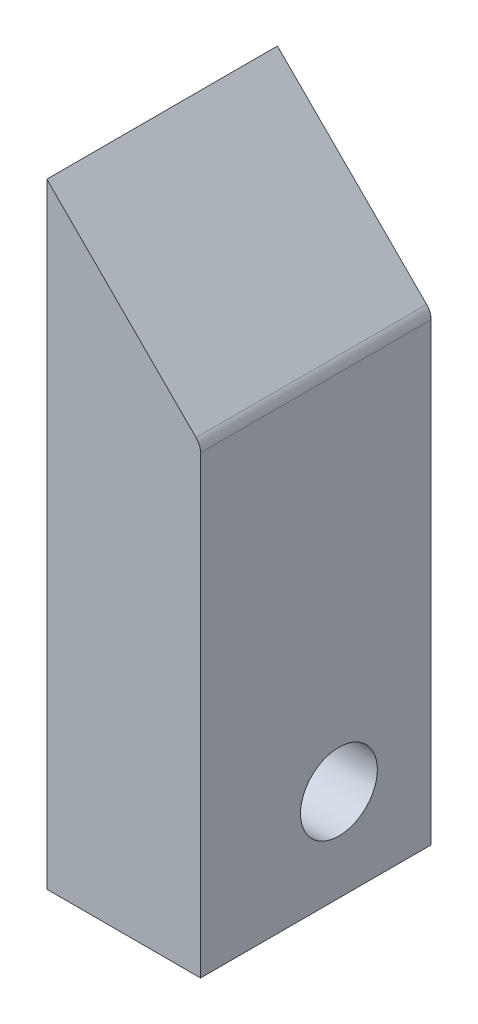
ISO-10303-21;
HEADER;
FILE_DESCRIPTION(('STEP AP214'),'2;1');
FILE_NAME('part.step','',(''),(''),'','','');
FILE_SCHEMA(('AUTOMOTIVE_DESIGN { 1 0 10303 214 1 1 1 1 }'));
ENDSEC;
DATA;
#1=APPLICATION_CONTEXT('core data for automotive mechanical design processes');
#2=APPLICATION_PROTOCOL_DEFINITION('international standard','automotive_design',2000,#1);
#3=PRODUCT_CONTEXT('',#1,'mechanical');
#4=PRODUCT('Part','Part','',(#3));
#5=PRODUCT_RELATED_PRODUCT_CATEGORY('part','',(#4));
#6=PRODUCT_DEFINITION_FORMATION('','',#4);
#7=PRODUCT_DEFINITION_CONTEXT('part definition',#1,'design');
#8=PRODUCT_DEFINITION('design','',#6,#7);
#9=PRODUCT_DEFINITION_SHAPE('','',#8);
#10=(LENGTH_UNIT() NAMED_UNIT(*) SI_UNIT(.MILLI.,.METRE.));
#11=(NAMED_UNIT(*) PLANE_ANGLE_UNIT() SI_UNIT($,.RADIAN.));
#12=(NAMED_UNIT(*) SI_UNIT($,.STERADIAN.) SOLID_ANGLE_UNIT());
#13=UNCERTAINTY_MEASURE_WITH_UNIT(LENGTH_MEASURE(1.E-05),#10,'distance_accuracy_value','');
#14=(GEOMETRIC_REPRESENTATION_CONTEXT(3) GLOBAL_UNCERTAINTY_ASSIGNED_CONTEXT((#13)) GLOBAL_UNIT_ASSIGNED_CONTEXT((#10,
#11,#12)) REPRESENTATION_CONTEXT('',''));
#15=CARTESIAN_POINT('',(0.,0.,0.));
#16=DIRECTION('',(0.,0.,1.));
#17=DIRECTION('',(1.,0.,0.));
#18=AXIS2_PLACEMENT_3D('',#15,#16,#17);
#19=CARTESIAN_POINT('',(0.,6.,6.));
#20=DIRECTION('',(1.,0.,0.));
#21=DIRECTION('',(0.,1.,0.));
#22=AXIS2_PLACEMENT_3D('',#19,#20,#21);
#23=CYLINDRICAL_SURFACE('',#22,2.5);
#24=CARTESIAN_POINT('',(10.,6.,6.));
#25=DIRECTION('',(1.,0.,0.));
#26=DIRECTION('',(0.,1.,0.));
#27=AXIS2_PLACEMENT_3D('',#24,#25,#26);
#28=CIRCLE('',#27,2.5);
#29=CARTESIAN_POINT('',(10.,8.5,6.));
#30=VERTEX_POINT('',#29);
#31=EDGE_CURVE('E175',#30,#30,#28,.T.);
#32=ORIENTED_EDGE('',*,*,#31,.T.);
#33=EDGE_LOOP('',(#32));
#34=FACE_BOUND('',#33,.T.);
#35=DIRECTION('',(-1.,0.,0.));
#36=VECTOR('',#35,1.);
#37=CARTESIAN_POINT('',(0.,3.5,6.));
#38=LINE('',#37,#36);
#39=CARTESIAN_POINT('',(2.5,3.5,6.));
#40=VERTEX_POINT('',#39);
#41=CARTESIAN_POINT('',(0.,3.5,6.));
#42=VERTEX_POINT('',#41);
#43=EDGE_CURVE('E131',#40,#42,#38,.T.);
#44=ORIENTED_EDGE('',*,*,#43,.T.);
#45=CARTESIAN_POINT('',(0.,6.,6.));
#46=DIRECTION('',(1.,0.,0.));
#47=DIRECTION('',(0.,1.,0.));
#48=AXIS2_PLACEMENT_3D('',#45,#46,#47);
#49=CIRCLE('',#48,2.5);
#50=CARTESIAN_POINT('',(0.,8.5,6.));
#51=VERTEX_POINT('',#50);
#52=EDGE_CURVE('E167',#51,#42,#49,.T.);
#53=ORIENTED_EDGE('',*,*,#52,.F.);
#54=DIRECTION('',(-1.,0.,0.));
#55=VECTOR('',#54,1.);
#56=CARTESIAN_POINT('',(0.,8.5,6.));
#57=LINE('',#56,#55);
#58=CARTESIAN_POINT('',(2.5,8.5,6.));
#59=VERTEX_POINT('',#58);
#60=EDGE_CURVE('E128',#59,#51,#57,.T.);
#61=ORIENTED_EDGE('',*,*,#60,.F.);
#62=CARTESIAN_POINT('',(2.5,6.,6.));
#63=DIRECTION('',(0.707106781186547,0.,0.707106781186547));
#64=DIRECTION('',(0.707106781186547,0.,-0.707106781186547));
#65=AXIS2_PLACEMENT_3D('',#62,#63,#64);
#66=ELLIPSE('',#65,3.53553390593274,2.5);
#67=EDGE_CURVE('E121',#59,#40,#66,.F.);
#68=ORIENTED_EDGE('',*,*,#67,.T.);
#69=EDGE_LOOP('',(#44,#53,#61,#68));
#70=FACE_BOUND('',#69,.T.);
#71=ADVANCED_FACE('F48',(#34,#70),#23,.F.);
#72=CARTESIAN_POINT('',(10.,0.,15.));
#73=DIRECTION('',(0.,1.,0.));
#74=DIRECTION('',(-1.,0.,0.));
#75=AXIS2_PLACEMENT_3D('',#72,#73,#74);
#76=PLANE('',#75);
#77=DIRECTION('',(1.,0.,0.));
#78=VECTOR('',#77,1.);
#79=CARTESIAN_POINT('',(10.,0.,0.));
#80=LINE('',#79,#78);
#81=CARTESIAN_POINT('',(0.,0.,0.));
#82=VERTEX_POINT('',#81);
#83=CARTESIAN_POINT('',(10.,0.,0.));
#84=VERTEX_POINT('',#83);
#85=EDGE_CURVE('E164',#82,#84,#80,.T.);
#86=ORIENTED_EDGE('',*,*,#85,.T.);
#87=DIRECTION('',(0.,0.,-1.));
#88=VECTOR('',#87,1.);
#89=CARTESIAN_POINT('',(10.,0.,15.));
#90=LINE('',#89,#88);
#91=CARTESIAN_POINT('',(10.,0.,15.));
#92=VERTEX_POINT('',#91);
#93=EDGE_CURVE('E140',#92,#84,#90,.T.);
#94=ORIENTED_EDGE('',*,*,#93,.F.);
#95=DIRECTION('',(1.,0.,0.));
#96=VECTOR('',#95,1.);
#97=CARTESIAN_POINT('',(10.,0.,15.));
#98=LINE('',#97,#96);
#99=CARTESIAN_POINT('',(0.,0.,15.));
#100=VERTEX_POINT('',#99);
#101=EDGE_CURVE('E158',#100,#92,#98,.T.);
#102=ORIENTED_EDGE('',*,*,#101,.F.);
#103=DIRECTION('',(0.,0.,-1.));
#104=VECTOR('',#103,1.);
#105=CARTESIAN_POINT('',(0.,0.,15.));
#106=LINE('',#105,#104);
#107=EDGE_CURVE('E151',#100,#82,#106,.T.);
#108=ORIENTED_EDGE('',*,*,#107,.T.);
#109=EDGE_LOOP('',(#86,#94,#102,#108));
#110=FACE_BOUND('',#109,.T.);
#111=ADVANCED_FACE('F204',(#110),#76,.F.);
#112=CARTESIAN_POINT('',(10.,30.,15.));
#113=DIRECTION('',(-1.,0.,0.));
#114=DIRECTION('',(0.,-1.,0.));
#115=AXIS2_PLACEMENT_3D('',#112,#113,#114);
#116=PLANE('',#115);
#117=ORIENTED_EDGE('',*,*,#31,.F.);
#118=EDGE_LOOP('',(#117));
#119=FACE_BOUND('',#118,.T.);
#120=DIRECTION('',(0.,1.,0.));
#121=VECTOR('',#120,1.);
#122=CARTESIAN_POINT('',(10.,30.,0.));
#123=LINE('',#122,#121);
#124=CARTESIAN_POINT('',(10.,29.5857864376269,0.));
#125=VERTEX_POINT('',#124);
#126=EDGE_CURVE('E162',#84,#125,#123,.T.);
#127=ORIENTED_EDGE('',*,*,#126,.T.);
#128=DIRECTION('',(0.,0.,-1.));
#129=VECTOR('',#128,1.);
#130=CARTESIAN_POINT('',(10.,29.5857864376269,15.));
#131=LINE('',#130,#129);
#132=CARTESIAN_POINT('',(10.,29.5857864376269,15.));
#133=VERTEX_POINT('',#132);
#134=EDGE_CURVE('E56',#125,#133,#131,.F.);
#135=ORIENTED_EDGE('',*,*,#134,.T.);
#136=DIRECTION('',(0.,1.,0.));
#137=VECTOR('',#136,1.);
#138=CARTESIAN_POINT('',(10.,30.,15.));
#139=LINE('',#138,#137);
#140=EDGE_CURVE('E171',#92,#133,#139,.T.);
#141=ORIENTED_EDGE('',*,*,#140,.F.);
#142=ORIENTED_EDGE('',*,*,#93,.T.);
#143=EDGE_LOOP('',(#127,#135,#141,#142));
#144=FACE_BOUND('',#143,.T.);
#145=ADVANCED_FACE('F206',(#119,#144),#116,.F.);
#146=CARTESIAN_POINT('',(0.,40.,15.));
#147=DIRECTION('',(-0.707106781186548,-0.707106781186547,0.));
#148=DIRECTION('',(0.707106781186547,-0.707106781186548,0.));
#149=AXIS2_PLACEMENT_3D('',#146,#147,#148);
#150=PLANE('',#149);
#151=DIRECTION('',(-0.707106781186547,0.707106781186548,0.));
#152=VECTOR('',#151,1.);
#153=CARTESIAN_POINT('',(0.,40.,15.));
#154=LINE('',#153,#152);
#155=CARTESIAN_POINT('',(9.70710678118654,30.2928932188135,15.));
#156=VERTEX_POINT('',#155);
#157=CARTESIAN_POINT('',(0.,40.,15.));
#158=VERTEX_POINT('',#157);
#159=EDGE_CURVE('E169',#156,#158,#154,.T.);
#160=ORIENTED_EDGE('',*,*,#159,.F.);
#161=DIRECTION('',(0.,0.,-1.));
#162=VECTOR('',#161,1.);
#163=CARTESIAN_POINT('',(9.70710678118654,30.2928932188135,15.));
#164=LINE('',#163,#162);
#165=CARTESIAN_POINT('',(9.70710678118654,30.2928932188135,0.));
#166=VERTEX_POINT('',#165);
#167=EDGE_CURVE('E139',#156,#166,#164,.T.);
#168=ORIENTED_EDGE('',*,*,#167,.T.);
#169=DIRECTION('',(-0.707106781186547,0.707106781186548,0.));
#170=VECTOR('',#169,1.);
#171=CARTESIAN_POINT('',(0.,40.,0.));
#172=LINE('',#171,#170);
#173=CARTESIAN_POINT('',(0.,40.,0.));
#174=VERTEX_POINT('',#173);
#175=EDGE_CURVE('E160',#166,#174,#172,.T.);
#176=ORIENTED_EDGE('',*,*,#175,.T.);
#177=DIRECTION('',(0.,0.,-1.));
#178=VECTOR('',#177,1.);
#179=CARTESIAN_POINT('',(0.,40.,15.));
#180=LINE('',#179,#178);
#181=EDGE_CURVE('E145',#158,#174,#180,.T.);
#182=ORIENTED_EDGE('',*,*,#181,.F.);
#183=EDGE_LOOP('',(#160,#168,#176,#182));
#184=FACE_BOUND('',#183,.T.);
#185=ADVANCED_FACE('F213',(#184),#150,.F.);
#186=CARTESIAN_POINT('',(0.,0.,15.));
#187=DIRECTION('',(1.,0.,0.));
#188=DIRECTION('',(0.,0.,-1.));
#189=AXIS2_PLACEMENT_3D('',#186,#187,#188);
#190=PLANE('',#189);
#191=ORIENTED_EDGE('',*,*,#52,.T.);
#192=DIRECTION('',(0.,0.,-1.));
#193=VECTOR('',#192,1.);
#194=CARTESIAN_POINT('',(0.,3.5,6.));
#195=LINE('',#194,#193);
#196=CARTESIAN_POINT('',(0.,3.5,0.));
#197=VERTEX_POINT('',#196);
#198=EDGE_CURVE('E127',#42,#197,#195,.T.);
#199=ORIENTED_EDGE('',*,*,#198,.T.);
#200=DIRECTION('',(0.,-1.,0.));
#201=VECTOR('',#200,1.);
#202=CARTESIAN_POINT('',(0.,0.,0.));
#203=LINE('',#202,#201);
#204=EDGE_CURVE('E159',#197,#82,#203,.T.);
#205=ORIENTED_EDGE('',*,*,#204,.T.);
#206=ORIENTED_EDGE('',*,*,#107,.F.);
#207=DIRECTION('',(0.,-1.,0.));
#208=VECTOR('',#207,1.);
#209=CARTESIAN_POINT('',(0.,0.,15.));
#210=LINE('',#209,#208);
#211=EDGE_CURVE('E154',#158,#100,#210,.T.);
#212=ORIENTED_EDGE('',*,*,#211,.F.);
#213=ORIENTED_EDGE('',*,*,#181,.T.);
#214=CARTESIAN_POINT('',(0.,8.5,0.));
#215=VERTEX_POINT('',#214);
#216=EDGE_CURVE('E155',#174,#215,#203,.T.);
#217=ORIENTED_EDGE('',*,*,#216,.T.);
#218=DIRECTION('',(0.,0.,-1.));
#219=VECTOR('',#218,1.);
#220=CARTESIAN_POINT('',(0.,8.5,6.));
#221=LINE('',#220,#219);
#222=EDGE_CURVE('E181',#51,#215,#221,.T.);
#223=ORIENTED_EDGE('',*,*,#222,.F.);
#224=EDGE_LOOP('',(#191,#199,#205,#206,#212,#213,#217,#223));
#225=FACE_BOUND('',#224,.T.);
#226=ADVANCED_FACE('F194',(#225),#190,.F.);
#227=CARTESIAN_POINT('',(0.,0.,15.));
#228=DIRECTION('',(0.,0.,-1.));
#229=DIRECTION('',(-1.,0.,0.));
#230=AXIS2_PLACEMENT_3D('',#227,#228,#229);
#231=PLANE('',#230);
#232=ORIENTED_EDGE('',*,*,#140,.T.);
#233=CARTESIAN_POINT('',(9.,29.5857864376269,15.));
#234=DIRECTION('',(0.,0.,-1.));
#235=DIRECTION('',(-1.,0.,0.));
#236=AXIS2_PLACEMENT_3D('',#233,#234,#235);
#237=CIRCLE('',#236,1.);
#238=EDGE_CURVE('E12',#133,#156,#237,.F.);
#239=ORIENTED_EDGE('',*,*,#238,.T.);
#240=ORIENTED_EDGE('',*,*,#159,.T.);
#241=ORIENTED_EDGE('',*,*,#211,.T.);
#242=ORIENTED_EDGE('',*,*,#101,.T.);
#243=EDGE_LOOP('',(#232,#239,#240,#241,#242));
#244=FACE_BOUND('',#243,.T.);
#245=ADVANCED_FACE('F209',(#244),#231,.F.);
#246=CARTESIAN_POINT('',(0.,0.,0.));
#247=DIRECTION('',(0.,0.,-1.));
#248=DIRECTION('',(-1.,0.,0.));
#249=AXIS2_PLACEMENT_3D('',#246,#247,#248);
#250=PLANE('',#249);
#251=ORIENTED_EDGE('',*,*,#175,.F.);
#252=CARTESIAN_POINT('',(9.,29.5857864376269,0.));
#253=DIRECTION('',(0.,0.,-1.));
#254=DIRECTION('',(-1.,0.,0.));
#255=AXIS2_PLACEMENT_3D('',#252,#253,#254);
#256=CIRCLE('',#255,1.);
#257=EDGE_CURVE('E70',#166,#125,#256,.T.);
#258=ORIENTED_EDGE('',*,*,#257,.T.);
#259=ORIENTED_EDGE('',*,*,#126,.F.);
#260=ORIENTED_EDGE('',*,*,#85,.F.);
#261=ORIENTED_EDGE('',*,*,#204,.F.);
#262=DIRECTION('',(-1.,0.,0.));
#263=VECTOR('',#262,1.);
#264=CARTESIAN_POINT('',(0.,3.5,0.));
#265=LINE('',#264,#263);
#266=CARTESIAN_POINT('',(2.5,3.5,0.));
#267=VERTEX_POINT('',#266);
#268=EDGE_CURVE('E186',#267,#197,#265,.T.);
#269=ORIENTED_EDGE('',*,*,#268,.F.);
#270=CARTESIAN_POINT('',(2.5,6.,0.));
#271=DIRECTION('',(0.,0.,-1.));
#272=DIRECTION('',(-1.,0.,0.));
#273=AXIS2_PLACEMENT_3D('',#270,#271,#272);
#274=CIRCLE('',#273,2.5);
#275=CARTESIAN_POINT('',(2.5,8.5,0.));
#276=VERTEX_POINT('',#275);
#277=EDGE_CURVE('E124',#276,#267,#274,.T.);
#278=ORIENTED_EDGE('',*,*,#277,.F.);
#279=DIRECTION('',(-1.,0.,0.));
#280=VECTOR('',#279,1.);
#281=CARTESIAN_POINT('',(0.,8.5,0.));
#282=LINE('',#281,#280);
#283=EDGE_CURVE('E137',#276,#215,#282,.T.);
#284=ORIENTED_EDGE('',*,*,#283,.T.);
#285=ORIENTED_EDGE('',*,*,#216,.F.);
#286=EDGE_LOOP('',(#251,#258,#259,#260,#261,#269,#278,#284,#285));
#287=FACE_BOUND('',#286,.T.);
#288=ADVANCED_FACE('F198',(#287),#250,.T.);
#289=CARTESIAN_POINT('',(2.5,6.,6.));
#290=DIRECTION('',(0.,0.,-1.));
#291=DIRECTION('',(-1.,0.,0.));
#292=AXIS2_PLACEMENT_3D('',#289,#290,#291);
#293=CYLINDRICAL_SURFACE('',#292,2.5);
#294=DIRECTION('',(0.,0.,-1.));
#295=VECTOR('',#294,1.);
#296=CARTESIAN_POINT('',(2.5,8.5,6.));
#297=LINE('',#296,#295);
#298=EDGE_CURVE('E178',#59,#276,#297,.T.);
#299=ORIENTED_EDGE('',*,*,#298,.T.);
#300=ORIENTED_EDGE('',*,*,#277,.T.);
#301=DIRECTION('',(0.,0.,-1.));
#302=VECTOR('',#301,1.);
#303=CARTESIAN_POINT('',(2.5,3.5,6.));
#304=LINE('',#303,#302);
#305=EDGE_CURVE('E117',#40,#267,#304,.T.);
#306=ORIENTED_EDGE('',*,*,#305,.F.);
#307=ORIENTED_EDGE('',*,*,#67,.F.);
#308=EDGE_LOOP('',(#299,#300,#306,#307));
#309=FACE_BOUND('',#308,.T.);
#310=ADVANCED_FACE('F119',(#309),#293,.F.);
#311=CARTESIAN_POINT('',(0.,3.5,6.));
#312=DIRECTION('',(0.,-1.,0.));
#313=DIRECTION('',(1.,0.,0.));
#314=AXIS2_PLACEMENT_3D('',#311,#312,#313);
#315=PLANE('',#314);
#316=ORIENTED_EDGE('',*,*,#268,.T.);
#317=ORIENTED_EDGE('',*,*,#198,.F.);
#318=ORIENTED_EDGE('',*,*,#43,.F.);
#319=ORIENTED_EDGE('',*,*,#305,.T.);
#320=EDGE_LOOP('',(#316,#317,#318,#319));
#321=FACE_BOUND('',#320,.T.);
#322=ADVANCED_FACE('F132',(#321),#315,.F.);
#323=CARTESIAN_POINT('',(0.,8.5,6.));
#324=DIRECTION('',(0.,-1.,0.));
#325=DIRECTION('',(0.,0.,-1.));
#326=AXIS2_PLACEMENT_3D('',#323,#324,#325);
#327=PLANE('',#326);
#328=ORIENTED_EDGE('',*,*,#283,.F.);
#329=ORIENTED_EDGE('',*,*,#298,.F.);
#330=ORIENTED_EDGE('',*,*,#60,.T.);
#331=ORIENTED_EDGE('',*,*,#222,.T.);
#332=EDGE_LOOP('',(#328,#329,#330,#331));
#333=FACE_BOUND('',#332,.T.);
#334=ADVANCED_FACE('F192',(#333),#327,.T.);
#335=CARTESIAN_POINT('',(9.,29.5857864376269,15.));
#336=DIRECTION('',(0.,0.,-1.));
#337=DIRECTION('',(-1.,0.,0.));
#338=AXIS2_PLACEMENT_3D('',#335,#336,#337);
#339=CYLINDRICAL_SURFACE('',#338,1.);
#340=ORIENTED_EDGE('',*,*,#238,.F.);
#341=ORIENTED_EDGE('',*,*,#134,.F.);
#342=ORIENTED_EDGE('',*,*,#257,.F.);
#343=ORIENTED_EDGE('',*,*,#167,.F.);
#344=EDGE_LOOP('',(#340,#341,#342,#343));
#345=FACE_BOUND('',#344,.T.);
#346=ADVANCED_FACE('F50',(#345),#339,.T.);
#347=CLOSED_SHELL('',(#71,#111,#145,#185,#226,#245,#288,#310,#322,#334,#346));
#348=MANIFOLD_SOLID_BREP('B2',#347);
#349=ADVANCED_BREP_SHAPE_REPRESENTATION('',(#18,#348),#14);
#350=SHAPE_DEFINITION_REPRESENTATION(#9,#349);
ENDSEC;
END-ISO-10303-21;
